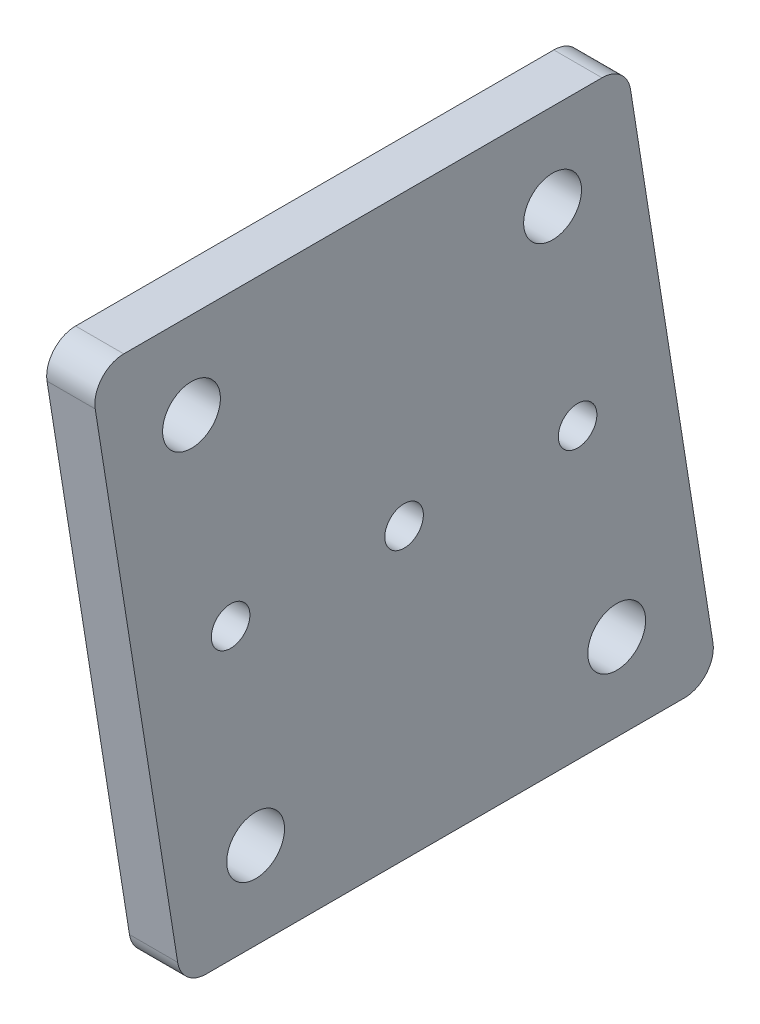
ISO-10303-21;
HEADER;
FILE_DESCRIPTION(('STEP AP214'),'2;1');
FILE_NAME('part.step','',(''),(''),'','','');
FILE_SCHEMA(('AUTOMOTIVE_DESIGN { 1 0 10303 214 1 1 1 1 }'));
ENDSEC;
DATA;
#1=APPLICATION_CONTEXT('core data for automotive mechanical design processes');
#2=APPLICATION_PROTOCOL_DEFINITION('international standard','automotive_design',2000,#1);
#3=PRODUCT_CONTEXT('',#1,'mechanical');
#4=PRODUCT('Part','Part','',(#3));
#5=PRODUCT_RELATED_PRODUCT_CATEGORY('part','',(#4));
#6=PRODUCT_DEFINITION_FORMATION('','',#4);
#7=PRODUCT_DEFINITION_CONTEXT('part definition',#1,'design');
#8=PRODUCT_DEFINITION('design','',#6,#7);
#9=PRODUCT_DEFINITION_SHAPE('','',#8);
#10=(LENGTH_UNIT() NAMED_UNIT(*) SI_UNIT(.MILLI.,.METRE.));
#11=(NAMED_UNIT(*) PLANE_ANGLE_UNIT() SI_UNIT($,.RADIAN.));
#12=(NAMED_UNIT(*) SI_UNIT($,.STERADIAN.) SOLID_ANGLE_UNIT());
#13=UNCERTAINTY_MEASURE_WITH_UNIT(LENGTH_MEASURE(1.E-05),#10,'distance_accuracy_value','');
#14=(GEOMETRIC_REPRESENTATION_CONTEXT(3) GLOBAL_UNCERTAINTY_ASSIGNED_CONTEXT((#13)) GLOBAL_UNIT_ASSIGNED_CONTEXT((#10,
#11,#12)) REPRESENTATION_CONTEXT('',''));
#15=CARTESIAN_POINT('',(0.,0.,0.));
#16=DIRECTION('',(0.,0.,1.));
#17=DIRECTION('',(1.,0.,0.));
#18=AXIS2_PLACEMENT_3D('',#15,#16,#17);
#19=CARTESIAN_POINT('',(5.,0.,0.));
#20=DIRECTION('',(1.,0.,0.));
#21=DIRECTION('',(0.,0.,-1.));
#22=AXIS2_PLACEMENT_3D('',#19,#20,#21);
#23=PLANE('',#22);
#24=CARTESIAN_POINT('',(5.,21.,2.59546841973727));
#25=DIRECTION('',(1.,0.,0.));
#26=DIRECTION('',(0.,0.,-1.));
#27=AXIS2_PLACEMENT_3D('',#24,#25,#26);
#28=CIRCLE('',#27,2.);
#29=CARTESIAN_POINT('',(5.,21.,0.595468419737274));
#30=VERTEX_POINT('',#29);
#31=EDGE_CURVE('E205',#30,#30,#28,.T.);
#32=ORIENTED_EDGE('',*,*,#31,.F.);
#33=EDGE_LOOP('',(#32));
#34=FACE_BOUND('',#33,.T.);
#35=CARTESIAN_POINT('',(5.,42.,-30.8090631605254));
#36=DIRECTION('',(1.,0.,0.));
#37=DIRECTION('',(0.,0.,-1.));
#38=AXIS2_PLACEMENT_3D('',#35,#36,#37);
#39=CIRCLE('',#38,3.);
#40=CARTESIAN_POINT('',(5.,42.,-33.8090631605254));
#41=VERTEX_POINT('',#40);
#42=EDGE_CURVE('E193',#41,#41,#39,.T.);
#43=ORIENTED_EDGE('',*,*,#42,.F.);
#44=EDGE_LOOP('',(#43));
#45=FACE_BOUND('',#44,.T.);
#46=CARTESIAN_POINT('',(5.,0.,-37.4612096541561));
#47=DIRECTION('',(1.,0.,0.));
#48=DIRECTION('',(0.,0.,-1.));
#49=AXIS2_PLACEMENT_3D('',#46,#47,#48);
#50=CIRCLE('',#49,3.);
#51=CARTESIAN_POINT('',(5.,0.,-40.4612096541561));
#52=VERTEX_POINT('',#51);
#53=EDGE_CURVE('E182',#52,#52,#50,.T.);
#54=ORIENTED_EDGE('',*,*,#53,.F.);
#55=EDGE_LOOP('',(#54));
#56=FACE_BOUND('',#55,.T.);
#57=DIRECTION('',(0.,0.987688340595137,0.156434465040235));
#58=VECTOR('',#57,1.);
#59=CARTESIAN_POINT('',(5.,-9.,-47.998855749169));
#60=LINE('',#59,#58);
#61=CARTESIAN_POINT('',(5.,-5.53069660487929,-47.4493720726168));
#62=VERTEX_POINT('',#61);
#63=CARTESIAN_POINT('',(5.,48.4693033951207,-38.8966122950916));
#64=VERTEX_POINT('',#63);
#65=EDGE_CURVE('E177',#62,#64,#60,.T.);
#66=ORIENTED_EDGE('',*,*,#65,.T.);
#67=CARTESIAN_POINT('',(5.,48.,-35.9335472733062));
#68=DIRECTION('',(1.,0.,0.));
#69=DIRECTION('',(0.,0.,-1.));
#70=AXIS2_PLACEMENT_3D('',#67,#68,#69);
#71=CIRCLE('',#70,3.);
#72=CARTESIAN_POINT('',(5.,51.,-35.9335472733062));
#73=VERTEX_POINT('',#72);
#74=EDGE_CURVE('E154',#64,#73,#71,.T.);
#75=ORIENTED_EDGE('',*,*,#74,.T.);
#76=DIRECTION('',(0.,0.,1.));
#77=VECTOR('',#76,1.);
#78=CARTESIAN_POINT('',(5.,51.,-38.4957893296966));
#79=LINE('',#78,#77);
#80=CARTESIAN_POINT('',(5.,51.,13.6772438903059));
#81=VERTEX_POINT('',#80);
#82=EDGE_CURVE('E125',#73,#81,#79,.T.);
#83=ORIENTED_EDGE('',*,*,#82,.T.);
#84=CARTESIAN_POINT('',(5.,48.,13.6772438903059));
#85=DIRECTION('',(1.,0.,0.));
#86=DIRECTION('',(0.,0.,-1.));
#87=AXIS2_PLACEMENT_3D('',#84,#85,#86);
#88=CIRCLE('',#87,3.);
#89=CARTESIAN_POINT('',(5.,47.5306966048793,16.6403089120913));
#90=VERTEX_POINT('',#89);
#91=EDGE_CURVE('E149',#81,#90,#88,.T.);
#92=ORIENTED_EDGE('',*,*,#91,.T.);
#93=DIRECTION('',(0.,-0.987688340595137,-0.156434465040234));
#94=VECTOR('',#93,1.);
#95=CARTESIAN_POINT('',(5.,51.,17.1897925886436));
#96=LINE('',#95,#94);
#97=CARTESIAN_POINT('',(5.,-6.46930339512068,8.08754913456619));
#98=VERTEX_POINT('',#97);
#99=EDGE_CURVE('E132',#90,#98,#96,.T.);
#100=ORIENTED_EDGE('',*,*,#99,.T.);
#101=CARTESIAN_POINT('',(5.,-6.,5.12448411278078));
#102=DIRECTION('',(1.,0.,0.));
#103=DIRECTION('',(0.,0.,-1.));
#104=AXIS2_PLACEMENT_3D('',#101,#102,#103);
#105=CIRCLE('',#104,3.);
#106=CARTESIAN_POINT('',(5.,-9.,5.12448411278078));
#107=VERTEX_POINT('',#106);
#108=EDGE_CURVE('E61',#98,#107,#105,.T.);
#109=ORIENTED_EDGE('',*,*,#108,.T.);
#110=DIRECTION('',(0.,0.,-1.));
#111=VECTOR('',#110,1.);
#112=CARTESIAN_POINT('',(5.,-9.,7.68672616917117));
#113=LINE('',#112,#111);
#114=CARTESIAN_POINT('',(5.,-9.,-44.4863070508314));
#115=VERTEX_POINT('',#114);
#116=EDGE_CURVE('E135',#107,#115,#113,.T.);
#117=ORIENTED_EDGE('',*,*,#116,.T.);
#118=CARTESIAN_POINT('',(5.,-6.,-44.4863070508314));
#119=DIRECTION('',(1.,0.,0.));
#120=DIRECTION('',(0.,0.,-1.));
#121=AXIS2_PLACEMENT_3D('',#118,#119,#120);
#122=CIRCLE('',#121,3.);
#123=EDGE_CURVE('E152',#115,#62,#122,.T.);
#124=ORIENTED_EDGE('',*,*,#123,.T.);
#125=EDGE_LOOP('',(#66,#75,#83,#92,#100,#109,#117,#124));
#126=FACE_BOUND('',#125,.T.);
#127=CARTESIAN_POINT('',(5.,0.,0.));
#128=DIRECTION('',(1.,0.,0.));
#129=DIRECTION('',(0.,0.,-1.));
#130=AXIS2_PLACEMENT_3D('',#127,#128,#129);
#131=CIRCLE('',#130,3.);
#132=CARTESIAN_POINT('',(5.,0.,-3.));
#133=VERTEX_POINT('',#132);
#134=EDGE_CURVE('E170',#133,#133,#131,.T.);
#135=ORIENTED_EDGE('',*,*,#134,.F.);
#136=EDGE_LOOP('',(#135));
#137=FACE_BOUND('',#136,.T.);
#138=CARTESIAN_POINT('',(5.,42.,6.65214649363068));
#139=DIRECTION('',(1.,0.,0.));
#140=DIRECTION('',(0.,0.,-1.));
#141=AXIS2_PLACEMENT_3D('',#138,#139,#140);
#142=CIRCLE('',#141,3.);
#143=CARTESIAN_POINT('',(5.,42.,3.65214649363068));
#144=VERTEX_POINT('',#143);
#145=EDGE_CURVE('E187',#144,#144,#142,.T.);
#146=ORIENTED_EDGE('',*,*,#145,.F.);
#147=EDGE_LOOP('',(#146));
#148=FACE_BOUND('',#147,.T.);
#149=CARTESIAN_POINT('',(5.,21.,-15.4045315802627));
#150=DIRECTION('',(1.,0.,0.));
#151=DIRECTION('',(0.,0.,-1.));
#152=AXIS2_PLACEMENT_3D('',#149,#150,#151);
#153=CIRCLE('',#152,2.00000000000001);
#154=CARTESIAN_POINT('',(5.,21.,-17.4045315802627));
#155=VERTEX_POINT('',#154);
#156=EDGE_CURVE('E199',#155,#155,#153,.T.);
#157=ORIENTED_EDGE('',*,*,#156,.F.);
#158=EDGE_LOOP('',(#157));
#159=FACE_BOUND('',#158,.T.);
#160=CARTESIAN_POINT('',(5.,21.,-33.4045315802627));
#161=DIRECTION('',(1.,0.,0.));
#162=DIRECTION('',(0.,0.,-1.));
#163=AXIS2_PLACEMENT_3D('',#160,#161,#162);
#164=CIRCLE('',#163,2.);
#165=CARTESIAN_POINT('',(5.,21.,-35.4045315802627));
#166=VERTEX_POINT('',#165);
#167=EDGE_CURVE('E211',#166,#166,#164,.T.);
#168=ORIENTED_EDGE('',*,*,#167,.F.);
#169=EDGE_LOOP('',(#168));
#170=FACE_BOUND('',#169,.T.);
#171=ADVANCED_FACE('F39',(#34,#45,#56,#126,#137,#148,#159,#170),#23,.T.);
#172=CARTESIAN_POINT('',(0.,0.,0.));
#173=DIRECTION('',(1.,0.,0.));
#174=DIRECTION('',(0.,0.,-1.));
#175=AXIS2_PLACEMENT_3D('',#172,#173,#174);
#176=PLANE('',#175);
#177=DIRECTION('',(0.,0.,1.));
#178=VECTOR('',#177,1.);
#179=CARTESIAN_POINT('',(0.,51.,-38.4957893296966));
#180=LINE('',#179,#178);
#181=CARTESIAN_POINT('',(0.,51.,-35.9335472733062));
#182=VERTEX_POINT('',#181);
#183=CARTESIAN_POINT('',(0.,51.,13.6772438903059));
#184=VERTEX_POINT('',#183);
#185=EDGE_CURVE('E122',#182,#184,#180,.T.);
#186=ORIENTED_EDGE('',*,*,#185,.F.);
#187=CARTESIAN_POINT('',(0.,48.,-35.9335472733062));
#188=DIRECTION('',(1.,0.,0.));
#189=DIRECTION('',(0.,0.,-1.));
#190=AXIS2_PLACEMENT_3D('',#187,#188,#189);
#191=CIRCLE('',#190,3.);
#192=CARTESIAN_POINT('',(0.,48.4693033951207,-38.8966122950916));
#193=VERTEX_POINT('',#192);
#194=EDGE_CURVE('E105',#182,#193,#191,.F.);
#195=ORIENTED_EDGE('',*,*,#194,.T.);
#196=DIRECTION('',(0.,0.987688340595137,0.156434465040235));
#197=VECTOR('',#196,1.);
#198=CARTESIAN_POINT('',(0.,-9.,-47.998855749169));
#199=LINE('',#198,#197);
#200=CARTESIAN_POINT('',(0.,-5.53069660487929,-47.4493720726168));
#201=VERTEX_POINT('',#200);
#202=EDGE_CURVE('E133',#201,#193,#199,.T.);
#203=ORIENTED_EDGE('',*,*,#202,.F.);
#204=CARTESIAN_POINT('',(0.,-6.,-44.4863070508314));
#205=DIRECTION('',(1.,0.,0.));
#206=DIRECTION('',(0.,0.,-1.));
#207=AXIS2_PLACEMENT_3D('',#204,#205,#206);
#208=CIRCLE('',#207,3.);
#209=CARTESIAN_POINT('',(0.,-9.,-44.4863070508314));
#210=VERTEX_POINT('',#209);
#211=EDGE_CURVE('E116',#201,#210,#208,.F.);
#212=ORIENTED_EDGE('',*,*,#211,.T.);
#213=DIRECTION('',(0.,0.,-1.));
#214=VECTOR('',#213,1.);
#215=CARTESIAN_POINT('',(0.,-9.,7.68672616917117));
#216=LINE('',#215,#214);
#217=CARTESIAN_POINT('',(0.,-9.,5.12448411278078));
#218=VERTEX_POINT('',#217);
#219=EDGE_CURVE('E137',#218,#210,#216,.T.);
#220=ORIENTED_EDGE('',*,*,#219,.F.);
#221=CARTESIAN_POINT('',(0.,-6.,5.12448411278078));
#222=DIRECTION('',(1.,0.,0.));
#223=DIRECTION('',(0.,0.,-1.));
#224=AXIS2_PLACEMENT_3D('',#221,#222,#223);
#225=CIRCLE('',#224,3.);
#226=CARTESIAN_POINT('',(0.,-6.46930339512068,8.08754913456619));
#227=VERTEX_POINT('',#226);
#228=EDGE_CURVE('E143',#218,#227,#225,.F.);
#229=ORIENTED_EDGE('',*,*,#228,.T.);
#230=DIRECTION('',(0.,-0.987688340595137,-0.156434465040234));
#231=VECTOR('',#230,1.);
#232=CARTESIAN_POINT('',(0.,51.,17.1897925886436));
#233=LINE('',#232,#231);
#234=CARTESIAN_POINT('',(0.,47.5306966048793,16.6403089120913));
#235=VERTEX_POINT('',#234);
#236=EDGE_CURVE('E165',#235,#227,#233,.T.);
#237=ORIENTED_EDGE('',*,*,#236,.F.);
#238=CARTESIAN_POINT('',(0.,48.,13.6772438903059));
#239=DIRECTION('',(1.,0.,0.));
#240=DIRECTION('',(0.,0.,-1.));
#241=AXIS2_PLACEMENT_3D('',#238,#239,#240);
#242=CIRCLE('',#241,3.);
#243=EDGE_CURVE('E126',#235,#184,#242,.F.);
#244=ORIENTED_EDGE('',*,*,#243,.T.);
#245=EDGE_LOOP('',(#186,#195,#203,#212,#220,#229,#237,#244));
#246=FACE_BOUND('',#245,.T.);
#247=CARTESIAN_POINT('',(0.,0.,0.));
#248=DIRECTION('',(1.,0.,0.));
#249=DIRECTION('',(0.,0.,-1.));
#250=AXIS2_PLACEMENT_3D('',#247,#248,#249);
#251=CIRCLE('',#250,3.);
#252=CARTESIAN_POINT('',(0.,0.,-3.));
#253=VERTEX_POINT('',#252);
#254=EDGE_CURVE('E173',#253,#253,#251,.T.);
#255=ORIENTED_EDGE('',*,*,#254,.T.);
#256=EDGE_LOOP('',(#255));
#257=FACE_BOUND('',#256,.T.);
#258=CARTESIAN_POINT('',(0.,0.,-37.4612096541561));
#259=DIRECTION('',(1.,0.,0.));
#260=DIRECTION('',(0.,0.,-1.));
#261=AXIS2_PLACEMENT_3D('',#258,#259,#260);
#262=CIRCLE('',#261,3.);
#263=CARTESIAN_POINT('',(0.,0.,-40.4612096541561));
#264=VERTEX_POINT('',#263);
#265=EDGE_CURVE('E184',#264,#264,#262,.T.);
#266=ORIENTED_EDGE('',*,*,#265,.T.);
#267=EDGE_LOOP('',(#266));
#268=FACE_BOUND('',#267,.T.);
#269=CARTESIAN_POINT('',(0.,42.,6.65214649363068));
#270=DIRECTION('',(1.,0.,0.));
#271=DIRECTION('',(0.,0.,-1.));
#272=AXIS2_PLACEMENT_3D('',#269,#270,#271);
#273=CIRCLE('',#272,3.);
#274=CARTESIAN_POINT('',(0.,42.,3.65214649363068));
#275=VERTEX_POINT('',#274);
#276=EDGE_CURVE('E190',#275,#275,#273,.T.);
#277=ORIENTED_EDGE('',*,*,#276,.T.);
#278=EDGE_LOOP('',(#277));
#279=FACE_BOUND('',#278,.T.);
#280=CARTESIAN_POINT('',(0.,42.,-30.8090631605254));
#281=DIRECTION('',(1.,0.,0.));
#282=DIRECTION('',(0.,0.,-1.));
#283=AXIS2_PLACEMENT_3D('',#280,#281,#282);
#284=CIRCLE('',#283,3.);
#285=CARTESIAN_POINT('',(0.,42.,-33.8090631605254));
#286=VERTEX_POINT('',#285);
#287=EDGE_CURVE('E196',#286,#286,#284,.T.);
#288=ORIENTED_EDGE('',*,*,#287,.T.);
#289=EDGE_LOOP('',(#288));
#290=FACE_BOUND('',#289,.T.);
#291=CARTESIAN_POINT('',(0.,21.,-15.4045315802627));
#292=DIRECTION('',(1.,0.,0.));
#293=DIRECTION('',(0.,0.,-1.));
#294=AXIS2_PLACEMENT_3D('',#291,#292,#293);
#295=CIRCLE('',#294,2.00000000000001);
#296=CARTESIAN_POINT('',(0.,21.,-17.4045315802627));
#297=VERTEX_POINT('',#296);
#298=EDGE_CURVE('E202',#297,#297,#295,.T.);
#299=ORIENTED_EDGE('',*,*,#298,.T.);
#300=EDGE_LOOP('',(#299));
#301=FACE_BOUND('',#300,.T.);
#302=CARTESIAN_POINT('',(0.,21.,2.59546841973727));
#303=DIRECTION('',(1.,0.,0.));
#304=DIRECTION('',(0.,0.,-1.));
#305=AXIS2_PLACEMENT_3D('',#302,#303,#304);
#306=CIRCLE('',#305,2.);
#307=CARTESIAN_POINT('',(0.,21.,0.595468419737274));
#308=VERTEX_POINT('',#307);
#309=EDGE_CURVE('E208',#308,#308,#306,.T.);
#310=ORIENTED_EDGE('',*,*,#309,.T.);
#311=EDGE_LOOP('',(#310));
#312=FACE_BOUND('',#311,.T.);
#313=CARTESIAN_POINT('',(0.,21.,-33.4045315802627));
#314=DIRECTION('',(1.,0.,0.));
#315=DIRECTION('',(0.,0.,-1.));
#316=AXIS2_PLACEMENT_3D('',#313,#314,#315);
#317=CIRCLE('',#316,2.);
#318=CARTESIAN_POINT('',(0.,21.,-35.4045315802627));
#319=VERTEX_POINT('',#318);
#320=EDGE_CURVE('E214',#319,#319,#317,.T.);
#321=ORIENTED_EDGE('',*,*,#320,.T.);
#322=EDGE_LOOP('',(#321));
#323=FACE_BOUND('',#322,.T.);
#324=ADVANCED_FACE('F129',(#246,#257,#268,#279,#290,#301,#312,#323),#176,.F.);
#325=CARTESIAN_POINT('',(5.,51.,17.1897925886436));
#326=DIRECTION('',(0.,0.156434465040234,-0.987688340595137));
#327=DIRECTION('',(0.,0.987688340595137,0.156434465040234));
#328=AXIS2_PLACEMENT_3D('',#325,#326,#327);
#329=PLANE('',#328);
#330=ORIENTED_EDGE('',*,*,#236,.T.);
#331=DIRECTION('',(-1.,0.,0.));
#332=VECTOR('',#331,1.);
#333=CARTESIAN_POINT('',(5.,-6.4693033951207,8.08754913456619));
#334=LINE('',#333,#332);
#335=EDGE_CURVE('E11',#227,#98,#334,.F.);
#336=ORIENTED_EDGE('',*,*,#335,.T.);
#337=ORIENTED_EDGE('',*,*,#99,.F.);
#338=DIRECTION('',(-1.,0.,0.));
#339=VECTOR('',#338,1.);
#340=CARTESIAN_POINT('',(5.,47.5306966048793,16.6403089120913));
#341=LINE('',#340,#339);
#342=EDGE_CURVE('E47',#90,#235,#341,.T.);
#343=ORIENTED_EDGE('',*,*,#342,.T.);
#344=EDGE_LOOP('',(#330,#336,#337,#343));
#345=FACE_BOUND('',#344,.T.);
#346=ADVANCED_FACE('F164',(#345),#329,.F.);
#347=CARTESIAN_POINT('',(5.,-9.,7.68672616917117));
#348=DIRECTION('',(0.,1.,0.));
#349=DIRECTION('',(0.,0.,1.));
#350=AXIS2_PLACEMENT_3D('',#347,#348,#349);
#351=PLANE('',#350);
#352=ORIENTED_EDGE('',*,*,#219,.T.);
#353=DIRECTION('',(-1.,0.,0.));
#354=VECTOR('',#353,1.);
#355=CARTESIAN_POINT('',(5.,-9.,-44.4863070508314));
#356=LINE('',#355,#354);
#357=EDGE_CURVE('E54',#210,#115,#356,.F.);
#358=ORIENTED_EDGE('',*,*,#357,.T.);
#359=ORIENTED_EDGE('',*,*,#116,.F.);
#360=DIRECTION('',(-1.,0.,0.));
#361=VECTOR('',#360,1.);
#362=CARTESIAN_POINT('',(5.,-9.,5.12448411278078));
#363=LINE('',#362,#361);
#364=EDGE_CURVE('E156',#107,#218,#363,.T.);
#365=ORIENTED_EDGE('',*,*,#364,.T.);
#366=EDGE_LOOP('',(#352,#358,#359,#365));
#367=FACE_BOUND('',#366,.T.);
#368=ADVANCED_FACE('F242',(#367),#351,.F.);
#369=CARTESIAN_POINT('',(5.,-9.,-47.998855749169));
#370=DIRECTION('',(0.,-0.156434465040235,0.987688340595137));
#371=DIRECTION('',(0.,-0.987688340595137,-0.156434465040235));
#372=AXIS2_PLACEMENT_3D('',#369,#370,#371);
#373=PLANE('',#372);
#374=ORIENTED_EDGE('',*,*,#202,.T.);
#375=DIRECTION('',(-1.,0.,0.));
#376=VECTOR('',#375,1.);
#377=CARTESIAN_POINT('',(5.,48.4693033951207,-38.8966122950916));
#378=LINE('',#377,#376);
#379=EDGE_CURVE('E110',#193,#64,#378,.F.);
#380=ORIENTED_EDGE('',*,*,#379,.T.);
#381=ORIENTED_EDGE('',*,*,#65,.F.);
#382=DIRECTION('',(-1.,0.,0.));
#383=VECTOR('',#382,1.);
#384=CARTESIAN_POINT('',(5.,-5.53069660487929,-47.4493720726168));
#385=LINE('',#384,#383);
#386=EDGE_CURVE('E115',#62,#201,#385,.T.);
#387=ORIENTED_EDGE('',*,*,#386,.T.);
#388=EDGE_LOOP('',(#374,#380,#381,#387));
#389=FACE_BOUND('',#388,.T.);
#390=ADVANCED_FACE('F239',(#389),#373,.F.);
#391=CARTESIAN_POINT('',(5.,51.,-38.4957893296966));
#392=DIRECTION('',(0.,-1.,0.));
#393=DIRECTION('',(0.,0.,-1.));
#394=AXIS2_PLACEMENT_3D('',#391,#392,#393);
#395=PLANE('',#394);
#396=ORIENTED_EDGE('',*,*,#82,.F.);
#397=DIRECTION('',(-1.,0.,0.));
#398=VECTOR('',#397,1.);
#399=CARTESIAN_POINT('',(5.,51.,-35.9335472733062));
#400=LINE('',#399,#398);
#401=EDGE_CURVE('E109',#73,#182,#400,.T.);
#402=ORIENTED_EDGE('',*,*,#401,.T.);
#403=ORIENTED_EDGE('',*,*,#185,.T.);
#404=DIRECTION('',(-1.,0.,0.));
#405=VECTOR('',#404,1.);
#406=CARTESIAN_POINT('',(5.,51.,13.6772438903059));
#407=LINE('',#406,#405);
#408=EDGE_CURVE('E127',#184,#81,#407,.F.);
#409=ORIENTED_EDGE('',*,*,#408,.T.);
#410=EDGE_LOOP('',(#396,#402,#403,#409));
#411=FACE_BOUND('',#410,.T.);
#412=ADVANCED_FACE('F121',(#411),#395,.F.);
#413=CARTESIAN_POINT('',(5.,0.,0.));
#414=DIRECTION('',(-1.,0.,0.));
#415=DIRECTION('',(0.,0.,1.));
#416=AXIS2_PLACEMENT_3D('',#413,#414,#415);
#417=CYLINDRICAL_SURFACE('',#416,3.);
#418=ORIENTED_EDGE('',*,*,#134,.T.);
#419=EDGE_LOOP('',(#418));
#420=FACE_BOUND('',#419,.T.);
#421=ORIENTED_EDGE('',*,*,#254,.F.);
#422=EDGE_LOOP('',(#421));
#423=FACE_BOUND('',#422,.T.);
#424=ADVANCED_FACE('F234',(#420,#423),#417,.F.);
#425=CARTESIAN_POINT('',(5.,0.,-37.4612096541561));
#426=DIRECTION('',(-1.,0.,0.));
#427=DIRECTION('',(0.,0.,1.));
#428=AXIS2_PLACEMENT_3D('',#425,#426,#427);
#429=CYLINDRICAL_SURFACE('',#428,3.);
#430=ORIENTED_EDGE('',*,*,#53,.T.);
#431=EDGE_LOOP('',(#430));
#432=FACE_BOUND('',#431,.T.);
#433=ORIENTED_EDGE('',*,*,#265,.F.);
#434=EDGE_LOOP('',(#433));
#435=FACE_BOUND('',#434,.T.);
#436=ADVANCED_FACE('F294',(#432,#435),#429,.F.);
#437=CARTESIAN_POINT('',(5.,42.,6.65214649363068));
#438=DIRECTION('',(-1.,0.,0.));
#439=DIRECTION('',(0.,0.,1.));
#440=AXIS2_PLACEMENT_3D('',#437,#438,#439);
#441=CYLINDRICAL_SURFACE('',#440,3.);
#442=ORIENTED_EDGE('',*,*,#145,.T.);
#443=EDGE_LOOP('',(#442));
#444=FACE_BOUND('',#443,.T.);
#445=ORIENTED_EDGE('',*,*,#276,.F.);
#446=EDGE_LOOP('',(#445));
#447=FACE_BOUND('',#446,.T.);
#448=ADVANCED_FACE('F291',(#444,#447),#441,.F.);
#449=CARTESIAN_POINT('',(5.,42.,-30.8090631605254));
#450=DIRECTION('',(-1.,0.,0.));
#451=DIRECTION('',(0.,0.,1.));
#452=AXIS2_PLACEMENT_3D('',#449,#450,#451);
#453=CYLINDRICAL_SURFACE('',#452,3.);
#454=ORIENTED_EDGE('',*,*,#42,.T.);
#455=EDGE_LOOP('',(#454));
#456=FACE_BOUND('',#455,.T.);
#457=ORIENTED_EDGE('',*,*,#287,.F.);
#458=EDGE_LOOP('',(#457));
#459=FACE_BOUND('',#458,.T.);
#460=ADVANCED_FACE('F274',(#456,#459),#453,.F.);
#461=CARTESIAN_POINT('',(5.,21.,-15.4045315802627));
#462=DIRECTION('',(-1.,0.,0.));
#463=DIRECTION('',(0.,0.,1.));
#464=AXIS2_PLACEMENT_3D('',#461,#462,#463);
#465=CYLINDRICAL_SURFACE('',#464,2.00000000000001);
#466=ORIENTED_EDGE('',*,*,#156,.T.);
#467=EDGE_LOOP('',(#466));
#468=FACE_BOUND('',#467,.T.);
#469=ORIENTED_EDGE('',*,*,#298,.F.);
#470=EDGE_LOOP('',(#469));
#471=FACE_BOUND('',#470,.T.);
#472=ADVANCED_FACE('F270',(#468,#471),#465,.F.);
#473=CARTESIAN_POINT('',(5.,21.,2.59546841973727));
#474=DIRECTION('',(-1.,0.,0.));
#475=DIRECTION('',(0.,0.,1.));
#476=AXIS2_PLACEMENT_3D('',#473,#474,#475);
#477=CYLINDRICAL_SURFACE('',#476,2.);
#478=ORIENTED_EDGE('',*,*,#31,.T.);
#479=EDGE_LOOP('',(#478));
#480=FACE_BOUND('',#479,.T.);
#481=ORIENTED_EDGE('',*,*,#309,.F.);
#482=EDGE_LOOP('',(#481));
#483=FACE_BOUND('',#482,.T.);
#484=ADVANCED_FACE('F273',(#480,#483),#477,.F.);
#485=CARTESIAN_POINT('',(5.,21.,-33.4045315802627));
#486=DIRECTION('',(-1.,0.,0.));
#487=DIRECTION('',(0.,0.,1.));
#488=AXIS2_PLACEMENT_3D('',#485,#486,#487);
#489=CYLINDRICAL_SURFACE('',#488,2.);
#490=ORIENTED_EDGE('',*,*,#167,.T.);
#491=EDGE_LOOP('',(#490));
#492=FACE_BOUND('',#491,.T.);
#493=ORIENTED_EDGE('',*,*,#320,.F.);
#494=EDGE_LOOP('',(#493));
#495=FACE_BOUND('',#494,.T.);
#496=ADVANCED_FACE('F220',(#492,#495),#489,.F.);
#497=CARTESIAN_POINT('',(5.,48.,-35.9335472733062));
#498=DIRECTION('',(-1.,0.,0.));
#499=DIRECTION('',(0.,0.,1.));
#500=AXIS2_PLACEMENT_3D('',#497,#498,#499);
#501=CYLINDRICAL_SURFACE('',#500,3.);
#502=ORIENTED_EDGE('',*,*,#74,.F.);
#503=ORIENTED_EDGE('',*,*,#379,.F.);
#504=ORIENTED_EDGE('',*,*,#194,.F.);
#505=ORIENTED_EDGE('',*,*,#401,.F.);
#506=EDGE_LOOP('',(#502,#503,#504,#505));
#507=FACE_BOUND('',#506,.T.);
#508=ADVANCED_FACE('F108',(#507),#501,.T.);
#509=CARTESIAN_POINT('',(5.,-6.,-44.4863070508314));
#510=DIRECTION('',(-1.,0.,0.));
#511=DIRECTION('',(0.,0.,1.));
#512=AXIS2_PLACEMENT_3D('',#509,#510,#511);
#513=CYLINDRICAL_SURFACE('',#512,3.);
#514=ORIENTED_EDGE('',*,*,#123,.F.);
#515=ORIENTED_EDGE('',*,*,#357,.F.);
#516=ORIENTED_EDGE('',*,*,#211,.F.);
#517=ORIENTED_EDGE('',*,*,#386,.F.);
#518=EDGE_LOOP('',(#514,#515,#516,#517));
#519=FACE_BOUND('',#518,.T.);
#520=ADVANCED_FACE('F250',(#519),#513,.T.);
#521=CARTESIAN_POINT('',(5.,-6.,5.12448411278078));
#522=DIRECTION('',(-1.,0.,0.));
#523=DIRECTION('',(0.,0.,1.));
#524=AXIS2_PLACEMENT_3D('',#521,#522,#523);
#525=CYLINDRICAL_SURFACE('',#524,3.);
#526=ORIENTED_EDGE('',*,*,#108,.F.);
#527=ORIENTED_EDGE('',*,*,#335,.F.);
#528=ORIENTED_EDGE('',*,*,#228,.F.);
#529=ORIENTED_EDGE('',*,*,#364,.F.);
#530=EDGE_LOOP('',(#526,#527,#528,#529));
#531=FACE_BOUND('',#530,.T.);
#532=ADVANCED_FACE('F252',(#531),#525,.T.);
#533=CARTESIAN_POINT('',(5.,48.,13.6772438903059));
#534=DIRECTION('',(-1.,0.,0.));
#535=DIRECTION('',(0.,0.,1.));
#536=AXIS2_PLACEMENT_3D('',#533,#534,#535);
#537=CYLINDRICAL_SURFACE('',#536,3.);
#538=ORIENTED_EDGE('',*,*,#91,.F.);
#539=ORIENTED_EDGE('',*,*,#408,.F.);
#540=ORIENTED_EDGE('',*,*,#243,.F.);
#541=ORIENTED_EDGE('',*,*,#342,.F.);
#542=EDGE_LOOP('',(#538,#539,#540,#541));
#543=FACE_BOUND('',#542,.T.);
#544=ADVANCED_FACE('F41',(#543),#537,.T.);
#545=CLOSED_SHELL('',(#171,#324,#346,#368,#390,#412,#424,#436,#448,#460,#472,#484,#496,#508,
#520,#532,#544));
#546=MANIFOLD_SOLID_BREP('B2',#545);
#547=ADVANCED_BREP_SHAPE_REPRESENTATION('',(#18,#546),#14);
#548=SHAPE_DEFINITION_REPRESENTATION(#9,#547);
ENDSEC;
END-ISO-10303-21;
